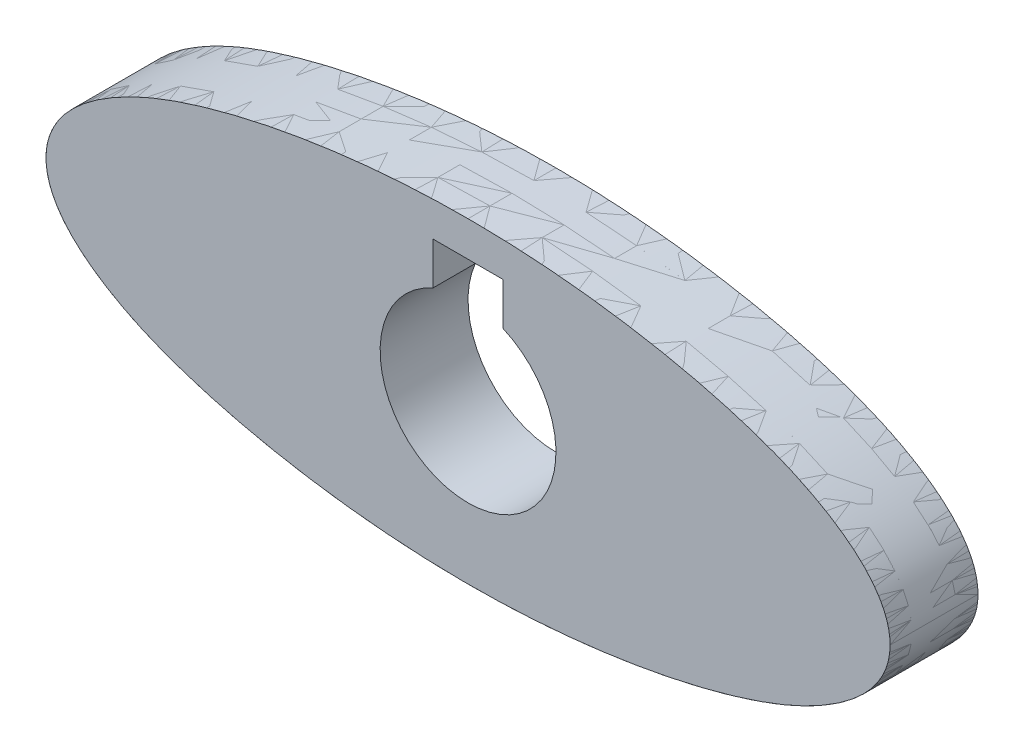
ISO-10303-21;
HEADER;
FILE_DESCRIPTION(('STEP AP214'),'2;1');
FILE_NAME('part.step','',(''),(''),'','','');
FILE_SCHEMA(('AUTOMOTIVE_DESIGN { 1 0 10303 214 1 1 1 1 }'));
ENDSEC;
DATA;
#1=APPLICATION_CONTEXT('core data for automotive mechanical design processes');
#2=APPLICATION_PROTOCOL_DEFINITION('international standard','automotive_design',2000,#1);
#3=PRODUCT_CONTEXT('',#1,'mechanical');
#4=PRODUCT('Part','Part','',(#3));
#5=PRODUCT_RELATED_PRODUCT_CATEGORY('part','',(#4));
#6=PRODUCT_DEFINITION_FORMATION('','',#4);
#7=PRODUCT_DEFINITION_CONTEXT('part definition',#1,'design');
#8=PRODUCT_DEFINITION('design','',#6,#7);
#9=PRODUCT_DEFINITION_SHAPE('','',#8);
#10=(LENGTH_UNIT() NAMED_UNIT(*) SI_UNIT(.MILLI.,.METRE.));
#11=(NAMED_UNIT(*) PLANE_ANGLE_UNIT() SI_UNIT($,.RADIAN.));
#12=(NAMED_UNIT(*) SI_UNIT($,.STERADIAN.) SOLID_ANGLE_UNIT());
#13=UNCERTAINTY_MEASURE_WITH_UNIT(LENGTH_MEASURE(1.E-05),#10,'distance_accuracy_value','');
#14=(GEOMETRIC_REPRESENTATION_CONTEXT(3) GLOBAL_UNCERTAINTY_ASSIGNED_CONTEXT((#13)) GLOBAL_UNIT_ASSIGNED_CONTEXT((#10,
#11,#12)) REPRESENTATION_CONTEXT('',''));
#15=CARTESIAN_POINT('',(0.,0.,0.));
#16=DIRECTION('',(0.,0.,1.));
#17=DIRECTION('',(1.,0.,0.));
#18=AXIS2_PLACEMENT_3D('',#15,#16,#17);
#19=CARTESIAN_POINT('',(24.,0.,5.));
#20=CARTESIAN_POINT('',(24.,1.5,5.));
#21=CARTESIAN_POINT('',(23.04,3.48,5.));
#22=CARTESIAN_POINT('',(15.36,7.32,5.));
#23=CARTESIAN_POINT('',(8.,9.,5.));
#24=CARTESIAN_POINT('',(-8.,9.,5.));
#25=CARTESIAN_POINT('',(-15.36,7.32,5.));
#26=CARTESIAN_POINT('',(-23.04,3.48,5.));
#27=CARTESIAN_POINT('',(-24.,1.5,5.));
#28=CARTESIAN_POINT('',(-24.,0.,5.));
#29=B_SPLINE_CURVE_WITH_KNOTS('',3,(#19,#20,#21,#22,#23,#24,#25,#26,#27,#28),.UNSPECIFIED.,.F.,
.F.,(4,2,2,2,4),(0.,0.25,0.5,0.75,1.),.UNSPECIFIED.);
#30=DIRECTION('',(0.,0.,-1.));
#31=VECTOR('',#30,1.);
#32=SURFACE_OF_LINEAR_EXTRUSION('',#29,#31);
#33=CARTESIAN_POINT('',(24.,0.,0.));
#34=CARTESIAN_POINT('',(24.,1.5,0.));
#35=CARTESIAN_POINT('',(23.04,3.48,0.));
#36=CARTESIAN_POINT('',(15.36,7.32,0.));
#37=CARTESIAN_POINT('',(8.,9.,0.));
#38=CARTESIAN_POINT('',(-8.,9.,0.));
#39=CARTESIAN_POINT('',(-15.36,7.32,0.));
#40=CARTESIAN_POINT('',(-23.04,3.48,0.));
#41=CARTESIAN_POINT('',(-24.,1.5,0.));
#42=CARTESIAN_POINT('',(-24.,0.,0.));
#43=B_SPLINE_CURVE_WITH_KNOTS('',3,(#33,#34,#35,#36,#37,#38,#39,#40,#41,#42),.UNSPECIFIED.,.F.,
.F.,(4,2,2,2,4),(0.,0.25,0.5,0.75,1.),.UNSPECIFIED.);
#44=CARTESIAN_POINT('',(24.,0.,0.));
#45=VERTEX_POINT('',#44);
#46=CARTESIAN_POINT('',(-24.,0.,0.));
#47=VERTEX_POINT('',#46);
#48=EDGE_CURVE('E53',#45,#47,#43,.T.);
#49=ORIENTED_EDGE('',*,*,#48,.F.);
#50=DIRECTION('',(0.,0.,-1.));
#51=VECTOR('',#50,1.);
#52=CARTESIAN_POINT('',(24.,0.,5.));
#53=LINE('',#52,#51);
#54=CARTESIAN_POINT('',(24.,0.,5.));
#55=VERTEX_POINT('',#54);
#56=EDGE_CURVE('E47',#55,#45,#53,.T.);
#57=ORIENTED_EDGE('',*,*,#56,.F.);
#58=CARTESIAN_POINT('',(-24.,0.,5.));
#59=VERTEX_POINT('',#58);
#60=EDGE_CURVE('E12',#55,#59,#29,.T.);
#61=ORIENTED_EDGE('',*,*,#60,.T.);
#62=DIRECTION('',(0.,0.,-1.));
#63=VECTOR('',#62,1.);
#64=CARTESIAN_POINT('',(-24.,0.,5.));
#65=LINE('',#64,#63);
#66=EDGE_CURVE('E61',#59,#47,#65,.T.);
#67=ORIENTED_EDGE('',*,*,#66,.T.);
#68=EDGE_LOOP('',(#49,#57,#61,#67));
#69=FACE_BOUND('',#68,.T.);
#70=ADVANCED_FACE('F44',(#69),#32,.T.);
#71=CARTESIAN_POINT('',(-24.,0.,5.));
#72=CARTESIAN_POINT('',(-24.,-1.5,5.));
#73=CARTESIAN_POINT('',(-23.04,-3.48,5.));
#74=CARTESIAN_POINT('',(-15.36,-7.32,5.));
#75=CARTESIAN_POINT('',(-8.,-9.,5.));
#76=CARTESIAN_POINT('',(8.,-9.,5.));
#77=CARTESIAN_POINT('',(15.36,-7.32,5.));
#78=CARTESIAN_POINT('',(23.04,-3.48,5.));
#79=CARTESIAN_POINT('',(24.,-1.5,5.));
#80=CARTESIAN_POINT('',(24.,0.,5.));
#81=B_SPLINE_CURVE_WITH_KNOTS('',3,(#71,#72,#73,#74,#75,#76,#77,#78,#79,#80),.UNSPECIFIED.,.F.,
.F.,(4,2,2,2,4),(0.,0.25,0.5,0.75,1.),.UNSPECIFIED.);
#82=DIRECTION('',(0.,0.,-1.));
#83=VECTOR('',#82,1.);
#84=SURFACE_OF_LINEAR_EXTRUSION('',#81,#83);
#85=CARTESIAN_POINT('',(-24.,0.,0.));
#86=CARTESIAN_POINT('',(-24.,-1.5,0.));
#87=CARTESIAN_POINT('',(-23.04,-3.48,0.));
#88=CARTESIAN_POINT('',(-15.36,-7.32,0.));
#89=CARTESIAN_POINT('',(-8.,-9.,0.));
#90=CARTESIAN_POINT('',(8.,-9.,0.));
#91=CARTESIAN_POINT('',(15.36,-7.32,0.));
#92=CARTESIAN_POINT('',(23.04,-3.48,0.));
#93=CARTESIAN_POINT('',(24.,-1.5,0.));
#94=CARTESIAN_POINT('',(24.,0.,0.));
#95=B_SPLINE_CURVE_WITH_KNOTS('',3,(#85,#86,#87,#88,#89,#90,#91,#92,#93,#94),.UNSPECIFIED.,.F.,
.F.,(4,2,2,2,4),(0.,0.25,0.5,0.75,1.),.UNSPECIFIED.);
#96=EDGE_CURVE('E73',#47,#45,#95,.T.);
#97=ORIENTED_EDGE('',*,*,#96,.F.);
#98=ORIENTED_EDGE('',*,*,#66,.F.);
#99=EDGE_CURVE('E72',#59,#55,#81,.T.);
#100=ORIENTED_EDGE('',*,*,#99,.T.);
#101=ORIENTED_EDGE('',*,*,#56,.T.);
#102=EDGE_LOOP('',(#97,#98,#100,#101));
#103=FACE_BOUND('',#102,.T.);
#104=ADVANCED_FACE('F74',(#103),#84,.T.);
#105=OPEN_SHELL('',(#70,#104));
#106=SHELL_BASED_SURFACE_MODEL('B2',(#105));
#107=CARTESIAN_POINT('',(24.,0.,5.));
#108=CARTESIAN_POINT('',(24.,-1.5,5.));
#109=CARTESIAN_POINT('',(23.04,-3.48,5.));
#110=CARTESIAN_POINT('',(15.36,-7.32,5.));
#111=CARTESIAN_POINT('',(8.,-9.,5.));
#112=CARTESIAN_POINT('',(-8.,-9.,5.));
#113=CARTESIAN_POINT('',(-15.36,-7.32,5.));
#114=CARTESIAN_POINT('',(-23.04,-3.48,5.));
#115=CARTESIAN_POINT('',(-24.,-1.5,5.));
#116=CARTESIAN_POINT('',(-24.,0.,5.));
#117=B_SPLINE_CURVE_WITH_KNOTS('',3,(#107,#108,#109,#110,#111,#112,#113,#114,#115,#116),
.UNSPECIFIED.,.F.,.F.,(4,2,2,2,4),(0.,0.25,0.5,0.75,1.),.UNSPECIFIED.);
#118=DIRECTION('',(0.,0.,-1.));
#119=VECTOR('',#118,1.);
#120=SURFACE_OF_LINEAR_EXTRUSION('',#117,#119);
#121=CARTESIAN_POINT('',(24.,0.,0.));
#122=CARTESIAN_POINT('',(24.,-1.5,0.));
#123=CARTESIAN_POINT('',(23.04,-3.48,0.));
#124=CARTESIAN_POINT('',(15.36,-7.32,0.));
#125=CARTESIAN_POINT('',(8.,-9.,0.));
#126=CARTESIAN_POINT('',(-8.,-9.,0.));
#127=CARTESIAN_POINT('',(-15.36,-7.32,0.));
#128=CARTESIAN_POINT('',(-23.04,-3.48,0.));
#129=CARTESIAN_POINT('',(-24.,-1.5,0.));
#130=CARTESIAN_POINT('',(-24.,0.,0.));
#131=B_SPLINE_CURVE_WITH_KNOTS('',3,(#121,#122,#123,#124,#125,#126,#127,#128,#129,#130),
.UNSPECIFIED.,.F.,.F.,(4,2,2,2,4),(0.,0.25,0.5,0.75,1.),.UNSPECIFIED.);
#132=CARTESIAN_POINT('',(24.,0.,0.));
#133=VERTEX_POINT('',#132);
#134=CARTESIAN_POINT('',(-24.,0.,0.));
#135=VERTEX_POINT('',#134);
#136=EDGE_CURVE('E169',#133,#135,#131,.T.);
#137=ORIENTED_EDGE('',*,*,#136,.F.);
#138=DIRECTION('',(0.,0.,-1.));
#139=VECTOR('',#138,1.);
#140=CARTESIAN_POINT('',(24.,0.,5.));
#141=LINE('',#140,#139);
#142=CARTESIAN_POINT('',(24.,0.,5.));
#143=VERTEX_POINT('',#142);
#144=EDGE_CURVE('E42',#143,#133,#141,.T.);
#145=ORIENTED_EDGE('',*,*,#144,.F.);
#146=CARTESIAN_POINT('',(-24.,0.,5.));
#147=VERTEX_POINT('',#146);
#148=EDGE_CURVE('E174',#143,#147,#117,.T.);
#149=ORIENTED_EDGE('',*,*,#148,.T.);
#150=DIRECTION('',(0.,0.,-1.));
#151=VECTOR('',#150,1.);
#152=CARTESIAN_POINT('',(-24.,0.,5.));
#153=LINE('',#152,#151);
#154=EDGE_CURVE('E132',#147,#135,#153,.T.);
#155=ORIENTED_EDGE('',*,*,#154,.T.);
#156=EDGE_LOOP('',(#137,#145,#149,#155));
#157=FACE_BOUND('',#156,.T.);
#158=ADVANCED_FACE('F128',(#157),#120,.T.);
#159=CARTESIAN_POINT('',(-24.,0.,5.));
#160=CARTESIAN_POINT('',(-24.,1.5,5.));
#161=CARTESIAN_POINT('',(-23.04,3.48,5.));
#162=CARTESIAN_POINT('',(-15.36,7.32,5.));
#163=CARTESIAN_POINT('',(-8.,9.,5.));
#164=CARTESIAN_POINT('',(8.,9.,5.));
#165=CARTESIAN_POINT('',(15.36,7.32,5.));
#166=CARTESIAN_POINT('',(23.04,3.48,5.));
#167=CARTESIAN_POINT('',(24.,1.5,5.));
#168=CARTESIAN_POINT('',(24.,0.,5.));
#169=B_SPLINE_CURVE_WITH_KNOTS('',3,(#159,#160,#161,#162,#163,#164,#165,#166,#167,#168),
.UNSPECIFIED.,.F.,.F.,(4,2,2,2,4),(0.,0.25,0.5,0.75,1.),.UNSPECIFIED.);
#170=DIRECTION('',(0.,0.,-1.));
#171=VECTOR('',#170,1.);
#172=SURFACE_OF_LINEAR_EXTRUSION('',#169,#171);
#173=CARTESIAN_POINT('',(-24.,0.,0.));
#174=CARTESIAN_POINT('',(-24.,1.5,0.));
#175=CARTESIAN_POINT('',(-23.04,3.48,0.));
#176=CARTESIAN_POINT('',(-15.36,7.32,0.));
#177=CARTESIAN_POINT('',(-8.,9.,0.));
#178=CARTESIAN_POINT('',(8.,9.,0.));
#179=CARTESIAN_POINT('',(15.36,7.32,0.));
#180=CARTESIAN_POINT('',(23.04,3.48,0.));
#181=CARTESIAN_POINT('',(24.,1.5,0.));
#182=CARTESIAN_POINT('',(24.,0.,0.));
#183=B_SPLINE_CURVE_WITH_KNOTS('',3,(#173,#174,#175,#176,#177,#178,#179,#180,#181,#182),
.UNSPECIFIED.,.F.,.F.,(4,2,2,2,4),(0.,0.25,0.5,0.75,1.),.UNSPECIFIED.);
#184=EDGE_CURVE('E165',#135,#133,#183,.T.);
#185=ORIENTED_EDGE('',*,*,#184,.F.);
#186=ORIENTED_EDGE('',*,*,#154,.F.);
#187=EDGE_CURVE('E167',#147,#143,#169,.T.);
#188=ORIENTED_EDGE('',*,*,#187,.T.);
#189=ORIENTED_EDGE('',*,*,#144,.T.);
#190=EDGE_LOOP('',(#185,#186,#188,#189));
#191=FACE_BOUND('',#190,.T.);
#192=ADVANCED_FACE('F163',(#191),#172,.T.);
#193=CARTESIAN_POINT('',(0.,-9.,5.));
#194=DIRECTION('',(0.,0.,1.));
#195=DIRECTION('',(1.,0.,0.));
#196=AXIS2_PLACEMENT_3D('',#193,#194,#195);
#197=PLANE('',#196);
#198=DIRECTION('',(0.,1.,0.));
#199=VECTOR('',#198,1.);
#200=CARTESIAN_POINT('',(2.,4.58257569495584,5.));
#201=LINE('',#200,#199);
#202=CARTESIAN_POINT('',(2.,4.58257569495584,5.));
#203=VERTEX_POINT('',#202);
#204=CARTESIAN_POINT('',(2.,7.,5.));
#205=VERTEX_POINT('',#204);
#206=EDGE_CURVE('E286',#203,#205,#201,.T.);
#207=ORIENTED_EDGE('',*,*,#206,.F.);
#208=CARTESIAN_POINT('',(0.,0.,5.));
#209=DIRECTION('',(0.,0.,-1.));
#210=DIRECTION('',(1.,0.,0.));
#211=AXIS2_PLACEMENT_3D('',#208,#209,#210);
#212=CIRCLE('',#211,5.);
#213=CARTESIAN_POINT('',(-2.,4.58257569495584,5.));
#214=VERTEX_POINT('',#213);
#215=EDGE_CURVE('E171',#203,#214,#212,.T.);
#216=ORIENTED_EDGE('',*,*,#215,.T.);
#217=DIRECTION('',(0.,-1.,0.));
#218=VECTOR('',#217,1.);
#219=CARTESIAN_POINT('',(-2.,4.58257569495584,5.));
#220=LINE('',#219,#218);
#221=CARTESIAN_POINT('',(-2.,7.,5.));
#222=VERTEX_POINT('',#221);
#223=EDGE_CURVE('E143',#222,#214,#220,.T.);
#224=ORIENTED_EDGE('',*,*,#223,.F.);
#225=DIRECTION('',(-1.,0.,0.));
#226=VECTOR('',#225,1.);
#227=CARTESIAN_POINT('',(-2.,7.,5.));
#228=LINE('',#227,#226);
#229=EDGE_CURVE('E274',#205,#222,#228,.T.);
#230=ORIENTED_EDGE('',*,*,#229,.F.);
#231=EDGE_LOOP('',(#207,#216,#224,#230));
#232=FACE_BOUND('',#231,.T.);
#233=ORIENTED_EDGE('',*,*,#148,.F.);
#234=ORIENTED_EDGE('',*,*,#187,.F.);
#235=EDGE_LOOP('',(#233,#234));
#236=FACE_BOUND('',#235,.T.);
#237=ADVANCED_FACE('F199',(#232,#236),#197,.T.);
#238=CARTESIAN_POINT('',(0.,-9.,0.));
#239=DIRECTION('',(0.,0.,1.));
#240=DIRECTION('',(1.,0.,0.));
#241=AXIS2_PLACEMENT_3D('',#238,#239,#240);
#242=PLANE('',#241);
#243=CARTESIAN_POINT('',(0.,0.,0.));
#244=DIRECTION('',(0.,0.,-1.));
#245=DIRECTION('',(1.,0.,0.));
#246=AXIS2_PLACEMENT_3D('',#243,#244,#245);
#247=CIRCLE('',#246,5.);
#248=CARTESIAN_POINT('',(2.,4.58257569495584,0.));
#249=VERTEX_POINT('',#248);
#250=CARTESIAN_POINT('',(-2.,4.58257569495584,0.));
#251=VERTEX_POINT('',#250);
#252=EDGE_CURVE('E301',#249,#251,#247,.T.);
#253=ORIENTED_EDGE('',*,*,#252,.F.);
#254=DIRECTION('',(0.,1.,0.));
#255=VECTOR('',#254,1.);
#256=CARTESIAN_POINT('',(2.,4.58257569495584,0.));
#257=LINE('',#256,#255);
#258=CARTESIAN_POINT('',(2.,7.,0.));
#259=VERTEX_POINT('',#258);
#260=EDGE_CURVE('E291',#249,#259,#257,.T.);
#261=ORIENTED_EDGE('',*,*,#260,.T.);
#262=DIRECTION('',(-1.,0.,0.));
#263=VECTOR('',#262,1.);
#264=CARTESIAN_POINT('',(-2.,7.,0.));
#265=LINE('',#264,#263);
#266=CARTESIAN_POINT('',(-2.,7.,0.));
#267=VERTEX_POINT('',#266);
#268=EDGE_CURVE('E294',#259,#267,#265,.T.);
#269=ORIENTED_EDGE('',*,*,#268,.T.);
#270=DIRECTION('',(0.,-1.,0.));
#271=VECTOR('',#270,1.);
#272=CARTESIAN_POINT('',(-2.,4.58257569495584,0.));
#273=LINE('',#272,#271);
#274=EDGE_CURVE('E306',#267,#251,#273,.T.);
#275=ORIENTED_EDGE('',*,*,#274,.T.);
#276=EDGE_LOOP('',(#253,#261,#269,#275));
#277=FACE_BOUND('',#276,.T.);
#278=ORIENTED_EDGE('',*,*,#136,.T.);
#279=ORIENTED_EDGE('',*,*,#184,.T.);
#280=EDGE_LOOP('',(#278,#279));
#281=FACE_BOUND('',#280,.T.);
#282=ADVANCED_FACE('F173',(#277,#281),#242,.F.);
#283=CARTESIAN_POINT('',(0.,0.,5.));
#284=DIRECTION('',(0.,0.,-1.));
#285=DIRECTION('',(-1.,0.,0.));
#286=AXIS2_PLACEMENT_3D('',#283,#284,#285);
#287=CYLINDRICAL_SURFACE('',#286,5.);
#288=ORIENTED_EDGE('',*,*,#215,.F.);
#289=DIRECTION('',(0.,0.,1.));
#290=VECTOR('',#289,1.);
#291=CARTESIAN_POINT('',(2.,4.58257569495584,0.));
#292=LINE('',#291,#290);
#293=EDGE_CURVE('E298',#249,#203,#292,.T.);
#294=ORIENTED_EDGE('',*,*,#293,.F.);
#295=ORIENTED_EDGE('',*,*,#252,.T.);
#296=DIRECTION('',(0.,0.,1.));
#297=VECTOR('',#296,1.);
#298=CARTESIAN_POINT('',(-2.,4.58257569495584,0.));
#299=LINE('',#298,#297);
#300=EDGE_CURVE('E302',#251,#214,#299,.T.);
#301=ORIENTED_EDGE('',*,*,#300,.T.);
#302=EDGE_LOOP('',(#288,#294,#295,#301));
#303=FACE_BOUND('',#302,.T.);
#304=ADVANCED_FACE('F202',(#303),#287,.F.);
#305=CARTESIAN_POINT('',(2.,4.58257569495584,0.));
#306=DIRECTION('',(1.,0.,0.));
#307=DIRECTION('',(0.,0.,-1.));
#308=AXIS2_PLACEMENT_3D('',#305,#306,#307);
#309=PLANE('',#308);
#310=ORIENTED_EDGE('',*,*,#206,.T.);
#311=DIRECTION('',(0.,0.,1.));
#312=VECTOR('',#311,1.);
#313=CARTESIAN_POINT('',(2.,7.,0.));
#314=LINE('',#313,#312);
#315=EDGE_CURVE('E281',#259,#205,#314,.T.);
#316=ORIENTED_EDGE('',*,*,#315,.F.);
#317=ORIENTED_EDGE('',*,*,#260,.F.);
#318=ORIENTED_EDGE('',*,*,#293,.T.);
#319=EDGE_LOOP('',(#310,#316,#317,#318));
#320=FACE_BOUND('',#319,.T.);
#321=ADVANCED_FACE('F209',(#320),#309,.F.);
#322=CARTESIAN_POINT('',(-2.,4.58257569495584,0.));
#323=DIRECTION('',(-1.,0.,0.));
#324=DIRECTION('',(0.,0.,1.));
#325=AXIS2_PLACEMENT_3D('',#322,#323,#324);
#326=PLANE('',#325);
#327=ORIENTED_EDGE('',*,*,#223,.T.);
#328=ORIENTED_EDGE('',*,*,#300,.F.);
#329=ORIENTED_EDGE('',*,*,#274,.F.);
#330=DIRECTION('',(0.,0.,1.));
#331=VECTOR('',#330,1.);
#332=CARTESIAN_POINT('',(-2.,7.,0.));
#333=LINE('',#332,#331);
#334=EDGE_CURVE('E277',#267,#222,#333,.T.);
#335=ORIENTED_EDGE('',*,*,#334,.T.);
#336=EDGE_LOOP('',(#327,#328,#329,#335));
#337=FACE_BOUND('',#336,.T.);
#338=ADVANCED_FACE('F213',(#337),#326,.F.);
#339=CARTESIAN_POINT('',(-2.,7.,0.));
#340=DIRECTION('',(0.,1.,0.));
#341=DIRECTION('',(0.,0.,1.));
#342=AXIS2_PLACEMENT_3D('',#339,#340,#341);
#343=PLANE('',#342);
#344=ORIENTED_EDGE('',*,*,#229,.T.);
#345=ORIENTED_EDGE('',*,*,#334,.F.);
#346=ORIENTED_EDGE('',*,*,#268,.F.);
#347=ORIENTED_EDGE('',*,*,#315,.T.);
#348=EDGE_LOOP('',(#344,#345,#346,#347));
#349=FACE_BOUND('',#348,.T.);
#350=ADVANCED_FACE('F215',(#349),#343,.F.);
#351=CLOSED_SHELL('',(#158,#192,#237,#282,#304,#321,#338,#350));
#352=MANIFOLD_SOLID_BREP('B6',#351);
#353=ADVANCED_BREP_SHAPE_REPRESENTATION('',(#18,#352),#14);
#354=MANIFOLD_SURFACE_SHAPE_REPRESENTATION('',(#18,#106),#14);
#355=SHAPE_REPRESENTATION('',(#18),#14);
#356=SHAPE_DEFINITION_REPRESENTATION(#9,#355);
#357=SHAPE_REPRESENTATION_RELATIONSHIP('','',#355,#353);
#358=SHAPE_REPRESENTATION_RELATIONSHIP('','',#355,#354);
ENDSEC;
END-ISO-10303-21;
